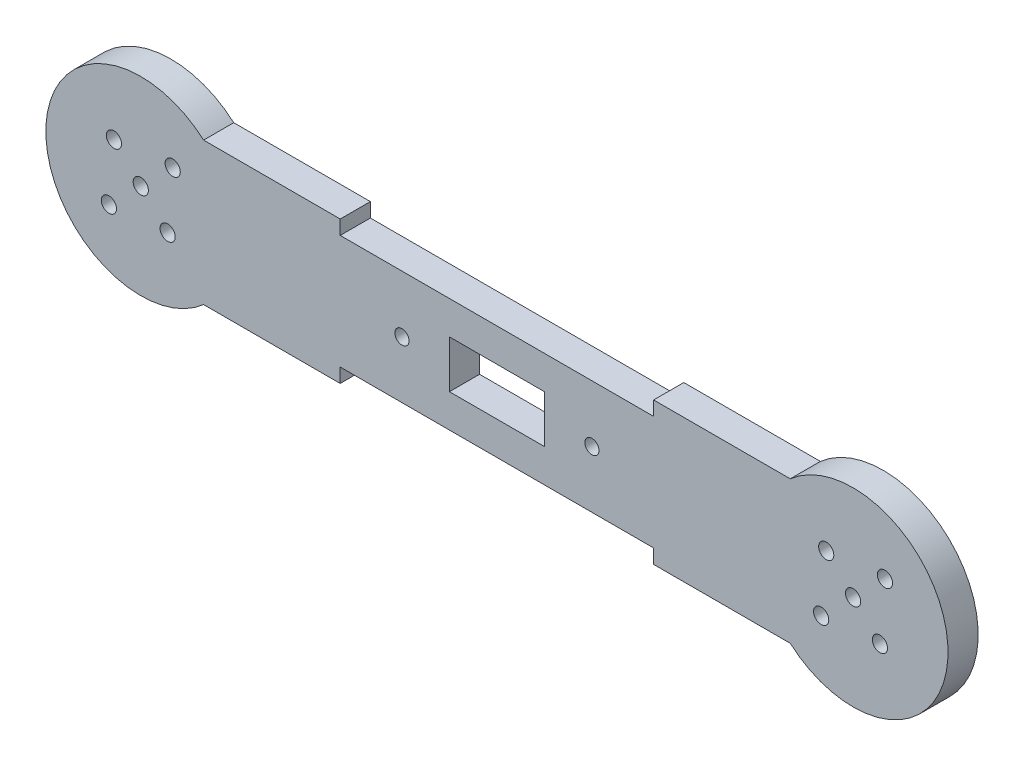
ISO-10303-21;
HEADER;
FILE_DESCRIPTION(('STEP AP214'),'2;1');
FILE_NAME('part.step','',(''),(''),'','','');
FILE_SCHEMA(('AUTOMOTIVE_DESIGN { 1 0 10303 214 1 1 1 1 }'));
ENDSEC;
DATA;
#1=APPLICATION_CONTEXT('core data for automotive mechanical design processes');
#2=APPLICATION_PROTOCOL_DEFINITION('international standard','automotive_design',2000,#1);
#3=PRODUCT_CONTEXT('',#1,'mechanical');
#4=PRODUCT('Part','Part','',(#3));
#5=PRODUCT_RELATED_PRODUCT_CATEGORY('part','',(#4));
#6=PRODUCT_DEFINITION_FORMATION('','',#4);
#7=PRODUCT_DEFINITION_CONTEXT('part definition',#1,'design');
#8=PRODUCT_DEFINITION('design','',#6,#7);
#9=PRODUCT_DEFINITION_SHAPE('','',#8);
#10=(LENGTH_UNIT() NAMED_UNIT(*) SI_UNIT(.MILLI.,.METRE.));
#11=(NAMED_UNIT(*) PLANE_ANGLE_UNIT() SI_UNIT($,.RADIAN.));
#12=(NAMED_UNIT(*) SI_UNIT($,.STERADIAN.) SOLID_ANGLE_UNIT());
#13=UNCERTAINTY_MEASURE_WITH_UNIT(LENGTH_MEASURE(1.E-05),#10,'distance_accuracy_value','');
#14=(GEOMETRIC_REPRESENTATION_CONTEXT(3) GLOBAL_UNCERTAINTY_ASSIGNED_CONTEXT((#13)) GLOBAL_UNIT_ASSIGNED_CONTEXT((#10,
#11,#12)) REPRESENTATION_CONTEXT('',''));
#15=CARTESIAN_POINT('',(0.,0.,0.));
#16=DIRECTION('',(0.,0.,1.));
#17=DIRECTION('',(1.,0.,0.));
#18=AXIS2_PLACEMENT_3D('',#15,#16,#17);
#19=CARTESIAN_POINT('',(-75.,0.,6.35));
#20=DIRECTION('',(0.,0.,1.));
#21=DIRECTION('',(1.,0.,0.));
#22=AXIS2_PLACEMENT_3D('',#19,#20,#21);
#23=PLANE('',#22);
#24=CARTESIAN_POINT('',(-75.,0.,6.35));
#25=DIRECTION('',(0.,0.,1.));
#26=DIRECTION('',(1.,0.,0.));
#27=AXIS2_PLACEMENT_3D('',#24,#25,#26);
#28=CIRCLE('',#27,1.59999999999999);
#29=CARTESIAN_POINT('',(-73.4,0.,6.35));
#30=VERTEX_POINT('',#29);
#31=EDGE_CURVE('E246',#30,#30,#28,.T.);
#32=ORIENTED_EDGE('',*,*,#31,.F.);
#33=EDGE_LOOP('',(#32));
#34=FACE_BOUND('',#33,.T.);
#35=CARTESIAN_POINT('',(75.,0.,6.35));
#36=DIRECTION('',(0.,0.,1.));
#37=DIRECTION('',(1.,0.,0.));
#38=AXIS2_PLACEMENT_3D('',#35,#36,#37);
#39=CIRCLE('',#38,1.59999999999999);
#40=CARTESIAN_POINT('',(76.6,0.,6.35));
#41=VERTEX_POINT('',#40);
#42=EDGE_CURVE('E325',#41,#41,#39,.T.);
#43=ORIENTED_EDGE('',*,*,#42,.F.);
#44=EDGE_LOOP('',(#43));
#45=FACE_BOUND('',#44,.T.);
#46=CARTESIAN_POINT('',(69.3431457505076,5.65685424949238,6.35));
#47=DIRECTION('',(0.,0.,1.));
#48=DIRECTION('',(1.,0.,0.));
#49=AXIS2_PLACEMENT_3D('',#46,#47,#48);
#50=CIRCLE('',#49,1.59999999999999);
#51=CARTESIAN_POINT('',(70.9431457505076,5.65685424949238,6.35));
#52=VERTEX_POINT('',#51);
#53=EDGE_CURVE('E312',#52,#52,#50,.T.);
#54=ORIENTED_EDGE('',*,*,#53,.F.);
#55=EDGE_LOOP('',(#54));
#56=FACE_BOUND('',#55,.T.);
#57=CARTESIAN_POINT('',(80.6568542494924,-5.65685424949241,6.35));
#58=DIRECTION('',(0.,0.,1.));
#59=DIRECTION('',(1.,0.,0.));
#60=AXIS2_PLACEMENT_3D('',#57,#58,#59);
#61=CIRCLE('',#60,1.59999999999999);
#62=CARTESIAN_POINT('',(82.2568542494924,-5.65685424949241,6.35));
#63=VERTEX_POINT('',#62);
#64=EDGE_CURVE('E321',#63,#63,#61,.T.);
#65=ORIENTED_EDGE('',*,*,#64,.F.);
#66=EDGE_LOOP('',(#65));
#67=FACE_BOUND('',#66,.T.);
#68=CARTESIAN_POINT('',(81.7175144212722,6.71751442127215,6.35));
#69=DIRECTION('',(0.,0.,1.));
#70=DIRECTION('',(1.,0.,0.));
#71=AXIS2_PLACEMENT_3D('',#68,#69,#70);
#72=CIRCLE('',#71,1.59999999999999);
#73=CARTESIAN_POINT('',(83.3175144212722,6.71751442127215,6.35));
#74=VERTEX_POINT('',#73);
#75=EDGE_CURVE('E347',#74,#74,#72,.T.);
#76=ORIENTED_EDGE('',*,*,#75,.F.);
#77=EDGE_LOOP('',(#76));
#78=FACE_BOUND('',#77,.T.);
#79=CARTESIAN_POINT('',(68.2824855787278,-6.71751442127219,6.35));
#80=DIRECTION('',(0.,0.,1.));
#81=DIRECTION('',(1.,0.,0.));
#82=AXIS2_PLACEMENT_3D('',#79,#80,#81);
#83=CIRCLE('',#82,1.59999999999999);
#84=CARTESIAN_POINT('',(69.8824855787278,-6.71751442127219,6.35));
#85=VERTEX_POINT('',#84);
#86=EDGE_CURVE('E354',#85,#85,#83,.T.);
#87=ORIENTED_EDGE('',*,*,#86,.F.);
#88=EDGE_LOOP('',(#87));
#89=FACE_BOUND('',#88,.T.);
#90=CARTESIAN_POINT('',(-68.2824855787278,6.71751442127221,6.35));
#91=DIRECTION('',(0.,0.,1.));
#92=DIRECTION('',(1.,0.,0.));
#93=AXIS2_PLACEMENT_3D('',#90,#91,#92);
#94=CIRCLE('',#93,1.59999999999999);
#95=CARTESIAN_POINT('',(-66.6824855787278,6.71751442127221,6.35));
#96=VERTEX_POINT('',#95);
#97=EDGE_CURVE('E362',#96,#96,#94,.T.);
#98=ORIENTED_EDGE('',*,*,#97,.F.);
#99=EDGE_LOOP('',(#98));
#100=FACE_BOUND('',#99,.T.);
#101=CARTESIAN_POINT('',(-80.6568542494924,5.65685424949235,6.35));
#102=DIRECTION('',(0.,0.,1.));
#103=DIRECTION('',(1.,0.,0.));
#104=AXIS2_PLACEMENT_3D('',#101,#102,#103);
#105=CIRCLE('',#104,1.59999999999999);
#106=CARTESIAN_POINT('',(-79.0568542494924,5.65685424949235,6.35));
#107=VERTEX_POINT('',#106);
#108=EDGE_CURVE('E373',#107,#107,#105,.T.);
#109=ORIENTED_EDGE('',*,*,#108,.F.);
#110=EDGE_LOOP('',(#109));
#111=FACE_BOUND('',#110,.T.);
#112=CARTESIAN_POINT('',(-69.3431457505076,-5.65685424949235,6.35));
#113=DIRECTION('',(0.,0.,1.));
#114=DIRECTION('',(1.,0.,0.));
#115=AXIS2_PLACEMENT_3D('',#112,#113,#114);
#116=CIRCLE('',#115,1.59999999999999);
#117=CARTESIAN_POINT('',(-67.7431457505076,-5.65685424949235,6.35));
#118=VERTEX_POINT('',#117);
#119=EDGE_CURVE('E380',#118,#118,#116,.T.);
#120=ORIENTED_EDGE('',*,*,#119,.F.);
#121=EDGE_LOOP('',(#120));
#122=FACE_BOUND('',#121,.T.);
#123=CARTESIAN_POINT('',(-81.7175144212722,-6.71751442127221,6.35));
#124=DIRECTION('',(0.,0.,1.));
#125=DIRECTION('',(1.,0.,0.));
#126=AXIS2_PLACEMENT_3D('',#123,#124,#125);
#127=CIRCLE('',#126,1.59999999999999);
#128=CARTESIAN_POINT('',(-80.1175144212722,-6.71751442127221,6.35));
#129=VERTEX_POINT('',#128);
#130=EDGE_CURVE('E388',#129,#129,#127,.T.);
#131=ORIENTED_EDGE('',*,*,#130,.F.);
#132=EDGE_LOOP('',(#131));
#133=FACE_BOUND('',#132,.T.);
#134=CARTESIAN_POINT('',(-20.,0.,6.35));
#135=DIRECTION('',(0.,0.,1.));
#136=DIRECTION('',(1.,0.,0.));
#137=AXIS2_PLACEMENT_3D('',#134,#135,#136);
#138=CIRCLE('',#137,1.5);
#139=CARTESIAN_POINT('',(-18.5,0.,6.35));
#140=VERTEX_POINT('',#139);
#141=EDGE_CURVE('E185',#140,#140,#138,.T.);
#142=ORIENTED_EDGE('',*,*,#141,.F.);
#143=EDGE_LOOP('',(#142));
#144=FACE_BOUND('',#143,.T.);
#145=CARTESIAN_POINT('',(20.,0.,6.35));
#146=DIRECTION('',(0.,0.,1.));
#147=DIRECTION('',(1.,0.,0.));
#148=AXIS2_PLACEMENT_3D('',#145,#146,#147);
#149=CIRCLE('',#148,1.5);
#150=CARTESIAN_POINT('',(21.5,0.,6.35));
#151=VERTEX_POINT('',#150);
#152=EDGE_CURVE('E401',#151,#151,#149,.T.);
#153=ORIENTED_EDGE('',*,*,#152,.F.);
#154=EDGE_LOOP('',(#153));
#155=FACE_BOUND('',#154,.T.);
#156=DIRECTION('',(-1.,0.,0.));
#157=VECTOR('',#156,1.);
#158=CARTESIAN_POINT('',(-10.,5.,6.35));
#159=LINE('',#158,#157);
#160=CARTESIAN_POINT('',(10.,5.,6.35));
#161=VERTEX_POINT('',#160);
#162=CARTESIAN_POINT('',(-10.,5.,6.35));
#163=VERTEX_POINT('',#162);
#164=EDGE_CURVE('E730',#161,#163,#159,.T.);
#165=ORIENTED_EDGE('',*,*,#164,.F.);
#166=DIRECTION('',(0.,1.,0.));
#167=VECTOR('',#166,1.);
#168=CARTESIAN_POINT('',(10.,5.,6.35));
#169=LINE('',#168,#167);
#170=CARTESIAN_POINT('',(10.,-5.,6.35));
#171=VERTEX_POINT('',#170);
#172=EDGE_CURVE('E732',#171,#161,#169,.T.);
#173=ORIENTED_EDGE('',*,*,#172,.F.);
#174=DIRECTION('',(1.,0.,0.));
#175=VECTOR('',#174,1.);
#176=CARTESIAN_POINT('',(-10.,-5.,6.35));
#177=LINE('',#176,#175);
#178=CARTESIAN_POINT('',(-9.99999999999999,-5.,6.35));
#179=VERTEX_POINT('',#178);
#180=EDGE_CURVE('E738',#179,#171,#177,.T.);
#181=ORIENTED_EDGE('',*,*,#180,.F.);
#182=DIRECTION('',(0.,-1.,0.));
#183=VECTOR('',#182,1.);
#184=CARTESIAN_POINT('',(-10.,5.,6.35));
#185=LINE('',#184,#183);
#186=EDGE_CURVE('E734',#163,#179,#185,.T.);
#187=ORIENTED_EDGE('',*,*,#186,.F.);
#188=EDGE_LOOP('',(#165,#173,#181,#187));
#189=FACE_BOUND('',#188,.T.);
#190=DIRECTION('',(1.,0.,0.));
#191=VECTOR('',#190,1.);
#192=CARTESIAN_POINT('',(-75.,-12.,6.35));
#193=LINE('',#192,#191);
#194=CARTESIAN_POINT('',(-33.,-12.,6.35));
#195=VERTEX_POINT('',#194);
#196=CARTESIAN_POINT('',(33.,-12.,6.35));
#197=VERTEX_POINT('',#196);
#198=EDGE_CURVE('E223',#195,#197,#193,.T.);
#199=ORIENTED_EDGE('',*,*,#198,.T.);
#200=DIRECTION('',(0.,-1.,0.));
#201=VECTOR('',#200,1.);
#202=CARTESIAN_POINT('',(33.,0.,6.35));
#203=LINE('',#202,#201);
#204=CARTESIAN_POINT('',(33.,-15.,6.35));
#205=VERTEX_POINT('',#204);
#206=EDGE_CURVE('E264',#197,#205,#203,.T.);
#207=ORIENTED_EDGE('',*,*,#206,.T.);
#208=DIRECTION('',(1.,0.,0.));
#209=VECTOR('',#208,1.);
#210=CARTESIAN_POINT('',(61.771243444677,-15.,6.35));
#211=LINE('',#210,#209);
#212=CARTESIAN_POINT('',(61.771243444677,-15.,6.35));
#213=VERTEX_POINT('',#212);
#214=EDGE_CURVE('E172',#205,#213,#211,.T.);
#215=ORIENTED_EDGE('',*,*,#214,.T.);
#216=CARTESIAN_POINT('',(75.,0.,6.35));
#217=DIRECTION('',(0.,0.,1.));
#218=DIRECTION('',(1.,0.,0.));
#219=AXIS2_PLACEMENT_3D('',#216,#217,#218);
#220=CIRCLE('',#219,20.);
#221=CARTESIAN_POINT('',(61.7712434446771,15.,6.35));
#222=VERTEX_POINT('',#221);
#223=EDGE_CURVE('E412',#213,#222,#220,.T.);
#224=ORIENTED_EDGE('',*,*,#223,.T.);
#225=DIRECTION('',(-1.,0.,0.));
#226=VECTOR('',#225,1.);
#227=CARTESIAN_POINT('',(61.7712434446771,15.,6.35));
#228=LINE('',#227,#226);
#229=CARTESIAN_POINT('',(33.,15.,6.35));
#230=VERTEX_POINT('',#229);
#231=EDGE_CURVE('E302',#222,#230,#228,.T.);
#232=ORIENTED_EDGE('',*,*,#231,.T.);
#233=DIRECTION('',(0.,1.,0.));
#234=VECTOR('',#233,1.);
#235=CARTESIAN_POINT('',(33.,0.,6.35));
#236=LINE('',#235,#234);
#237=CARTESIAN_POINT('',(33.,12.,6.35));
#238=VERTEX_POINT('',#237);
#239=EDGE_CURVE('E237',#238,#230,#236,.T.);
#240=ORIENTED_EDGE('',*,*,#239,.F.);
#241=DIRECTION('',(1.,0.,0.));
#242=VECTOR('',#241,1.);
#243=CARTESIAN_POINT('',(-75.,12.,6.35));
#244=LINE('',#243,#242);
#245=CARTESIAN_POINT('',(-33.,12.,6.35));
#246=VERTEX_POINT('',#245);
#247=EDGE_CURVE('E239',#246,#238,#244,.T.);
#248=ORIENTED_EDGE('',*,*,#247,.F.);
#249=DIRECTION('',(0.,-1.,0.));
#250=VECTOR('',#249,1.);
#251=CARTESIAN_POINT('',(-33.,0.,6.35));
#252=LINE('',#251,#250);
#253=CARTESIAN_POINT('',(-33.,15.,6.35));
#254=VERTEX_POINT('',#253);
#255=EDGE_CURVE('E234',#254,#246,#252,.T.);
#256=ORIENTED_EDGE('',*,*,#255,.F.);
#257=CARTESIAN_POINT('',(-61.771243444677,15.,6.35));
#258=VERTEX_POINT('',#257);
#259=EDGE_CURVE('E413',#254,#258,#228,.T.);
#260=ORIENTED_EDGE('',*,*,#259,.T.);
#261=CARTESIAN_POINT('',(-75.,0.,6.35));
#262=DIRECTION('',(0.,0.,1.));
#263=DIRECTION('',(1.,0.,0.));
#264=AXIS2_PLACEMENT_3D('',#261,#262,#263);
#265=CIRCLE('',#264,20.);
#266=CARTESIAN_POINT('',(-61.771243444677,-15.,6.35));
#267=VERTEX_POINT('',#266);
#268=EDGE_CURVE('E208',#258,#267,#265,.T.);
#269=ORIENTED_EDGE('',*,*,#268,.T.);
#270=CARTESIAN_POINT('',(-32.9999999999999,-15.,6.35));
#271=VERTEX_POINT('',#270);
#272=EDGE_CURVE('E278',#267,#271,#211,.T.);
#273=ORIENTED_EDGE('',*,*,#272,.T.);
#274=DIRECTION('',(0.,1.,0.));
#275=VECTOR('',#274,1.);
#276=CARTESIAN_POINT('',(-33.,0.,6.35));
#277=LINE('',#276,#275);
#278=EDGE_CURVE('E56',#271,#195,#277,.T.);
#279=ORIENTED_EDGE('',*,*,#278,.T.);
#280=EDGE_LOOP('',(#199,#207,#215,#224,#232,#240,#248,#256,#260,#269,#273,#279));
#281=FACE_BOUND('',#280,.T.);
#282=ADVANCED_FACE('F41',(#34,#45,#56,#67,#78,#89,#100,#111,#122,#133,#144,#155,#189,#281),#23,.T.);
#283=CARTESIAN_POINT('',(-75.,0.,0.));
#284=DIRECTION('',(0.,0.,1.));
#285=DIRECTION('',(1.,0.,0.));
#286=AXIS2_PLACEMENT_3D('',#283,#284,#285);
#287=PLANE('',#286);
#288=DIRECTION('',(0.,1.,0.));
#289=VECTOR('',#288,1.);
#290=CARTESIAN_POINT('',(10.,5.,0.));
#291=LINE('',#290,#289);
#292=CARTESIAN_POINT('',(9.99999999999999,-5.,0.));
#293=VERTEX_POINT('',#292);
#294=CARTESIAN_POINT('',(10.,5.,0.));
#295=VERTEX_POINT('',#294);
#296=EDGE_CURVE('E744',#293,#295,#291,.T.);
#297=ORIENTED_EDGE('',*,*,#296,.T.);
#298=DIRECTION('',(-1.,0.,0.));
#299=VECTOR('',#298,1.);
#300=CARTESIAN_POINT('',(-10.,5.,0.));
#301=LINE('',#300,#299);
#302=CARTESIAN_POINT('',(-10.,5.,0.));
#303=VERTEX_POINT('',#302);
#304=EDGE_CURVE('E749',#295,#303,#301,.T.);
#305=ORIENTED_EDGE('',*,*,#304,.T.);
#306=DIRECTION('',(0.,-1.,0.));
#307=VECTOR('',#306,1.);
#308=CARTESIAN_POINT('',(-10.,5.,0.));
#309=LINE('',#308,#307);
#310=CARTESIAN_POINT('',(-10.,-5.,0.));
#311=VERTEX_POINT('',#310);
#312=EDGE_CURVE('E756',#303,#311,#309,.T.);
#313=ORIENTED_EDGE('',*,*,#312,.T.);
#314=DIRECTION('',(1.,0.,0.));
#315=VECTOR('',#314,1.);
#316=CARTESIAN_POINT('',(-10.,-5.,0.));
#317=LINE('',#316,#315);
#318=EDGE_CURVE('E740',#311,#293,#317,.T.);
#319=ORIENTED_EDGE('',*,*,#318,.T.);
#320=EDGE_LOOP('',(#297,#305,#313,#319));
#321=FACE_BOUND('',#320,.T.);
#322=CARTESIAN_POINT('',(-20.,0.,0.));
#323=DIRECTION('',(0.,0.,1.));
#324=DIRECTION('',(1.,0.,0.));
#325=AXIS2_PLACEMENT_3D('',#322,#323,#324);
#326=CIRCLE('',#325,1.5);
#327=CARTESIAN_POINT('',(-18.5,0.,0.));
#328=VERTEX_POINT('',#327);
#329=EDGE_CURVE('E405',#328,#328,#326,.T.);
#330=ORIENTED_EDGE('',*,*,#329,.T.);
#331=EDGE_LOOP('',(#330));
#332=FACE_BOUND('',#331,.T.);
#333=CARTESIAN_POINT('',(20.,0.,0.));
#334=DIRECTION('',(0.,0.,1.));
#335=DIRECTION('',(1.,0.,0.));
#336=AXIS2_PLACEMENT_3D('',#333,#334,#335);
#337=CIRCLE('',#336,1.5);
#338=CARTESIAN_POINT('',(21.5,0.,0.));
#339=VERTEX_POINT('',#338);
#340=EDGE_CURVE('E395',#339,#339,#337,.T.);
#341=ORIENTED_EDGE('',*,*,#340,.T.);
#342=EDGE_LOOP('',(#341));
#343=FACE_BOUND('',#342,.T.);
#344=CARTESIAN_POINT('',(-81.7175144212722,-6.71751442127221,0.));
#345=DIRECTION('',(0.,0.,-1.));
#346=DIRECTION('',(-1.,0.,0.));
#347=AXIS2_PLACEMENT_3D('',#344,#345,#346);
#348=CIRCLE('',#347,1.59999999999999);
#349=CARTESIAN_POINT('',(-83.3175144212722,-6.71751442127221,0.));
#350=VERTEX_POINT('',#349);
#351=EDGE_CURVE('E383',#350,#350,#348,.T.);
#352=ORIENTED_EDGE('',*,*,#351,.F.);
#353=EDGE_LOOP('',(#352));
#354=FACE_BOUND('',#353,.T.);
#355=CARTESIAN_POINT('',(-69.3431457505076,-5.65685424949235,0.));
#356=DIRECTION('',(0.,0.,-1.));
#357=DIRECTION('',(-1.,0.,0.));
#358=AXIS2_PLACEMENT_3D('',#355,#356,#357);
#359=CIRCLE('',#358,1.59999999999999);
#360=CARTESIAN_POINT('',(-70.9431457505076,-5.65685424949235,0.));
#361=VERTEX_POINT('',#360);
#362=EDGE_CURVE('E375',#361,#361,#359,.T.);
#363=ORIENTED_EDGE('',*,*,#362,.F.);
#364=EDGE_LOOP('',(#363));
#365=FACE_BOUND('',#364,.T.);
#366=CARTESIAN_POINT('',(-80.6568542494924,5.65685424949235,0.));
#367=DIRECTION('',(0.,0.,-1.));
#368=DIRECTION('',(-1.,0.,0.));
#369=AXIS2_PLACEMENT_3D('',#366,#367,#368);
#370=CIRCLE('',#369,1.59999999999999);
#371=CARTESIAN_POINT('',(-82.2568542494924,5.65685424949235,0.));
#372=VERTEX_POINT('',#371);
#373=EDGE_CURVE('E368',#372,#372,#370,.T.);
#374=ORIENTED_EDGE('',*,*,#373,.F.);
#375=EDGE_LOOP('',(#374));
#376=FACE_BOUND('',#375,.T.);
#377=CARTESIAN_POINT('',(-68.2824855787278,6.71751442127221,0.));
#378=DIRECTION('',(0.,0.,-1.));
#379=DIRECTION('',(-1.,0.,0.));
#380=AXIS2_PLACEMENT_3D('',#377,#378,#379);
#381=CIRCLE('',#380,1.59999999999999);
#382=CARTESIAN_POINT('',(-69.8824855787278,6.71751442127221,0.));
#383=VERTEX_POINT('',#382);
#384=EDGE_CURVE('E357',#383,#383,#381,.T.);
#385=ORIENTED_EDGE('',*,*,#384,.F.);
#386=EDGE_LOOP('',(#385));
#387=FACE_BOUND('',#386,.T.);
#388=CARTESIAN_POINT('',(68.2824855787278,-6.71751442127219,0.));
#389=DIRECTION('',(0.,0.,-1.));
#390=DIRECTION('',(-1.,0.,0.));
#391=AXIS2_PLACEMENT_3D('',#388,#389,#390);
#392=CIRCLE('',#391,1.59999999999999);
#393=CARTESIAN_POINT('',(66.6824855787278,-6.71751442127219,0.));
#394=VERTEX_POINT('',#393);
#395=EDGE_CURVE('E349',#394,#394,#392,.T.);
#396=ORIENTED_EDGE('',*,*,#395,.F.);
#397=EDGE_LOOP('',(#396));
#398=FACE_BOUND('',#397,.T.);
#399=CARTESIAN_POINT('',(81.7175144212722,6.71751442127215,0.));
#400=DIRECTION('',(0.,0.,-1.));
#401=DIRECTION('',(-1.,0.,0.));
#402=AXIS2_PLACEMENT_3D('',#399,#400,#401);
#403=CIRCLE('',#402,1.59999999999999);
#404=CARTESIAN_POINT('',(80.1175144212722,6.71751442127215,0.));
#405=VERTEX_POINT('',#404);
#406=EDGE_CURVE('E342',#405,#405,#403,.T.);
#407=ORIENTED_EDGE('',*,*,#406,.F.);
#408=EDGE_LOOP('',(#407));
#409=FACE_BOUND('',#408,.T.);
#410=CARTESIAN_POINT('',(80.6568542494924,-5.65685424949241,0.));
#411=DIRECTION('',(0.,0.,-1.));
#412=DIRECTION('',(-1.,0.,0.));
#413=AXIS2_PLACEMENT_3D('',#410,#411,#412);
#414=CIRCLE('',#413,1.59999999999999);
#415=CARTESIAN_POINT('',(79.0568542494924,-5.65685424949241,0.));
#416=VERTEX_POINT('',#415);
#417=EDGE_CURVE('E314',#416,#416,#414,.T.);
#418=ORIENTED_EDGE('',*,*,#417,.F.);
#419=EDGE_LOOP('',(#418));
#420=FACE_BOUND('',#419,.T.);
#421=CARTESIAN_POINT('',(69.3431457505076,5.65685424949238,0.));
#422=DIRECTION('',(0.,0.,-1.));
#423=DIRECTION('',(-1.,0.,0.));
#424=AXIS2_PLACEMENT_3D('',#421,#422,#423);
#425=CIRCLE('',#424,1.59999999999999);
#426=CARTESIAN_POINT('',(67.7431457505077,5.65685424949238,0.));
#427=VERTEX_POINT('',#426);
#428=EDGE_CURVE('E315',#427,#427,#425,.T.);
#429=ORIENTED_EDGE('',*,*,#428,.F.);
#430=EDGE_LOOP('',(#429));
#431=FACE_BOUND('',#430,.T.);
#432=CARTESIAN_POINT('',(75.,0.,0.));
#433=DIRECTION('',(0.,0.,-1.));
#434=DIRECTION('',(-1.,0.,0.));
#435=AXIS2_PLACEMENT_3D('',#432,#433,#434);
#436=CIRCLE('',#435,1.59999999999999);
#437=CARTESIAN_POINT('',(73.4,0.,0.));
#438=VERTEX_POINT('',#437);
#439=EDGE_CURVE('E331',#438,#438,#436,.T.);
#440=ORIENTED_EDGE('',*,*,#439,.F.);
#441=EDGE_LOOP('',(#440));
#442=FACE_BOUND('',#441,.T.);
#443=CARTESIAN_POINT('',(-75.,0.,0.));
#444=DIRECTION('',(0.,0.,-1.));
#445=DIRECTION('',(-1.,0.,0.));
#446=AXIS2_PLACEMENT_3D('',#443,#444,#445);
#447=CIRCLE('',#446,1.59999999999999);
#448=CARTESIAN_POINT('',(-76.6,0.,0.));
#449=VERTEX_POINT('',#448);
#450=EDGE_CURVE('E241',#449,#449,#447,.T.);
#451=ORIENTED_EDGE('',*,*,#450,.F.);
#452=EDGE_LOOP('',(#451));
#453=FACE_BOUND('',#452,.T.);
#454=DIRECTION('',(0.,1.,0.));
#455=VECTOR('',#454,1.);
#456=CARTESIAN_POINT('',(33.,-15.,0.));
#457=LINE('',#456,#455);
#458=CARTESIAN_POINT('',(33.,-15.,0.));
#459=VERTEX_POINT('',#458);
#460=CARTESIAN_POINT('',(33.,-12.,0.));
#461=VERTEX_POINT('',#460);
#462=EDGE_CURVE('E153',#459,#461,#457,.T.);
#463=ORIENTED_EDGE('',*,*,#462,.T.);
#464=DIRECTION('',(-1.,0.,0.));
#465=VECTOR('',#464,1.);
#466=CARTESIAN_POINT('',(-33.,-12.,0.));
#467=LINE('',#466,#465);
#468=CARTESIAN_POINT('',(-33.,-12.,0.));
#469=VERTEX_POINT('',#468);
#470=EDGE_CURVE('E257',#461,#469,#467,.T.);
#471=ORIENTED_EDGE('',*,*,#470,.T.);
#472=DIRECTION('',(0.,-1.,0.));
#473=VECTOR('',#472,1.);
#474=CARTESIAN_POINT('',(-33.,-15.,0.));
#475=LINE('',#474,#473);
#476=CARTESIAN_POINT('',(-33.,-15.,0.));
#477=VERTEX_POINT('',#476);
#478=EDGE_CURVE('E164',#469,#477,#475,.T.);
#479=ORIENTED_EDGE('',*,*,#478,.T.);
#480=DIRECTION('',(1.,0.,0.));
#481=VECTOR('',#480,1.);
#482=CARTESIAN_POINT('',(61.771243444677,-15.,0.));
#483=LINE('',#482,#481);
#484=CARTESIAN_POINT('',(-61.771243444677,-15.,0.));
#485=VERTEX_POINT('',#484);
#486=EDGE_CURVE('E178',#485,#477,#483,.T.);
#487=ORIENTED_EDGE('',*,*,#486,.F.);
#488=CARTESIAN_POINT('',(-75.,0.,0.));
#489=DIRECTION('',(0.,0.,1.));
#490=DIRECTION('',(1.,0.,0.));
#491=AXIS2_PLACEMENT_3D('',#488,#489,#490);
#492=CIRCLE('',#491,20.);
#493=CARTESIAN_POINT('',(-61.771243444677,15.,0.));
#494=VERTEX_POINT('',#493);
#495=EDGE_CURVE('E179',#494,#485,#492,.T.);
#496=ORIENTED_EDGE('',*,*,#495,.F.);
#497=DIRECTION('',(-1.,0.,0.));
#498=VECTOR('',#497,1.);
#499=CARTESIAN_POINT('',(61.7712434446771,15.,0.));
#500=LINE('',#499,#498);
#501=CARTESIAN_POINT('',(-32.9999999999999,15.,0.));
#502=VERTEX_POINT('',#501);
#503=EDGE_CURVE('E209',#502,#494,#500,.T.);
#504=ORIENTED_EDGE('',*,*,#503,.F.);
#505=DIRECTION('',(0.,1.,0.));
#506=VECTOR('',#505,1.);
#507=CARTESIAN_POINT('',(-33.,15.,0.));
#508=LINE('',#507,#506);
#509=CARTESIAN_POINT('',(-33.,12.,0.));
#510=VERTEX_POINT('',#509);
#511=EDGE_CURVE('E64',#510,#502,#508,.T.);
#512=ORIENTED_EDGE('',*,*,#511,.F.);
#513=DIRECTION('',(-1.,0.,0.));
#514=VECTOR('',#513,1.);
#515=CARTESIAN_POINT('',(-33.,12.,0.));
#516=LINE('',#515,#514);
#517=CARTESIAN_POINT('',(33.,12.,0.));
#518=VERTEX_POINT('',#517);
#519=EDGE_CURVE('E222',#518,#510,#516,.T.);
#520=ORIENTED_EDGE('',*,*,#519,.F.);
#521=DIRECTION('',(0.,-1.,0.));
#522=VECTOR('',#521,1.);
#523=CARTESIAN_POINT('',(33.,15.,0.));
#524=LINE('',#523,#522);
#525=CARTESIAN_POINT('',(33.,15.,0.));
#526=VERTEX_POINT('',#525);
#527=EDGE_CURVE('E217',#526,#518,#524,.T.);
#528=ORIENTED_EDGE('',*,*,#527,.F.);
#529=CARTESIAN_POINT('',(61.7712434446771,15.,0.));
#530=VERTEX_POINT('',#529);
#531=EDGE_CURVE('E203',#530,#526,#500,.T.);
#532=ORIENTED_EDGE('',*,*,#531,.F.);
#533=CARTESIAN_POINT('',(75.,0.,0.));
#534=DIRECTION('',(0.,0.,1.));
#535=DIRECTION('',(1.,0.,0.));
#536=AXIS2_PLACEMENT_3D('',#533,#534,#535);
#537=CIRCLE('',#536,20.);
#538=CARTESIAN_POINT('',(61.771243444677,-15.,0.));
#539=VERTEX_POINT('',#538);
#540=EDGE_CURVE('E176',#539,#530,#537,.T.);
#541=ORIENTED_EDGE('',*,*,#540,.F.);
#542=EDGE_CURVE('E170',#459,#539,#483,.T.);
#543=ORIENTED_EDGE('',*,*,#542,.F.);
#544=EDGE_LOOP('',(#463,#471,#479,#487,#496,#504,#512,#520,#528,#532,#541,#543));
#545=FACE_BOUND('',#544,.T.);
#546=ADVANCED_FACE('F174',(#321,#332,#343,#354,#365,#376,#387,#398,#409,#420,#431,#442,#453,
#545),#287,.F.);
#547=CARTESIAN_POINT('',(61.771243444677,-15.,6.35));
#548=DIRECTION('',(0.,1.,0.));
#549=DIRECTION('',(-1.,0.,0.));
#550=AXIS2_PLACEMENT_3D('',#547,#548,#549);
#551=PLANE('',#550);
#552=DIRECTION('',(0.,0.,1.));
#553=VECTOR('',#552,1.);
#554=CARTESIAN_POINT('',(33.,-15.,6.35));
#555=LINE('',#554,#553);
#556=EDGE_CURVE('E12',#459,#205,#555,.T.);
#557=ORIENTED_EDGE('',*,*,#556,.F.);
#558=ORIENTED_EDGE('',*,*,#542,.T.);
#559=DIRECTION('',(0.,0.,-1.));
#560=VECTOR('',#559,1.);
#561=CARTESIAN_POINT('',(61.771243444677,-15.,6.35));
#562=LINE('',#561,#560);
#563=EDGE_CURVE('E283',#213,#539,#562,.T.);
#564=ORIENTED_EDGE('',*,*,#563,.F.);
#565=ORIENTED_EDGE('',*,*,#214,.F.);
#566=EDGE_LOOP('',(#557,#558,#564,#565));
#567=FACE_BOUND('',#566,.T.);
#568=ADVANCED_FACE('F168',(#567),#551,.F.);
#569=DIRECTION('',(0.,0.,-1.));
#570=VECTOR('',#569,1.);
#571=CARTESIAN_POINT('',(-33.,-15.,6.35));
#572=LINE('',#571,#570);
#573=EDGE_CURVE('E49',#271,#477,#572,.T.);
#574=ORIENTED_EDGE('',*,*,#573,.F.);
#575=ORIENTED_EDGE('',*,*,#272,.F.);
#576=DIRECTION('',(0.,0.,-1.));
#577=VECTOR('',#576,1.);
#578=CARTESIAN_POINT('',(-61.771243444677,-15.,6.35));
#579=LINE('',#578,#577);
#580=EDGE_CURVE('E277',#267,#485,#579,.T.);
#581=ORIENTED_EDGE('',*,*,#580,.T.);
#582=ORIENTED_EDGE('',*,*,#486,.T.);
#583=EDGE_LOOP('',(#574,#575,#581,#582));
#584=FACE_BOUND('',#583,.T.);
#585=ADVANCED_FACE('F275',(#584),#551,.F.);
#586=CARTESIAN_POINT('',(61.7712434446771,15.,6.35));
#587=DIRECTION('',(0.,-1.,0.));
#588=DIRECTION('',(1.,0.,0.));
#589=AXIS2_PLACEMENT_3D('',#586,#587,#588);
#590=PLANE('',#589);
#591=ORIENTED_EDGE('',*,*,#531,.T.);
#592=DIRECTION('',(0.,0.,1.));
#593=VECTOR('',#592,1.);
#594=CARTESIAN_POINT('',(33.,15.,6.35));
#595=LINE('',#594,#593);
#596=EDGE_CURVE('E308',#526,#230,#595,.T.);
#597=ORIENTED_EDGE('',*,*,#596,.T.);
#598=ORIENTED_EDGE('',*,*,#231,.F.);
#599=DIRECTION('',(0.,0.,-1.));
#600=VECTOR('',#599,1.);
#601=CARTESIAN_POINT('',(61.7712434446771,15.,6.35));
#602=LINE('',#601,#600);
#603=EDGE_CURVE('E296',#222,#530,#602,.T.);
#604=ORIENTED_EDGE('',*,*,#603,.T.);
#605=EDGE_LOOP('',(#591,#597,#598,#604));
#606=FACE_BOUND('',#605,.T.);
#607=ADVANCED_FACE('F299',(#606),#590,.F.);
#608=CARTESIAN_POINT('',(-75.,0.,6.35));
#609=DIRECTION('',(0.,0.,-1.));
#610=DIRECTION('',(-1.,0.,0.));
#611=AXIS2_PLACEMENT_3D('',#608,#609,#610);
#612=CYLINDRICAL_SURFACE('',#611,20.);
#613=ORIENTED_EDGE('',*,*,#495,.T.);
#614=ORIENTED_EDGE('',*,*,#580,.F.);
#615=ORIENTED_EDGE('',*,*,#268,.F.);
#616=DIRECTION('',(0.,0.,-1.));
#617=VECTOR('',#616,1.);
#618=CARTESIAN_POINT('',(-61.771243444677,15.,6.35));
#619=LINE('',#618,#617);
#620=EDGE_CURVE('E210',#258,#494,#619,.T.);
#621=ORIENTED_EDGE('',*,*,#620,.T.);
#622=EDGE_LOOP('',(#613,#614,#615,#621));
#623=FACE_BOUND('',#622,.T.);
#624=ADVANCED_FACE('F43',(#623),#612,.T.);
#625=CARTESIAN_POINT('',(75.,0.,6.35));
#626=DIRECTION('',(0.,0.,-1.));
#627=DIRECTION('',(-1.,0.,0.));
#628=AXIS2_PLACEMENT_3D('',#625,#626,#627);
#629=CYLINDRICAL_SURFACE('',#628,20.);
#630=ORIENTED_EDGE('',*,*,#540,.T.);
#631=ORIENTED_EDGE('',*,*,#603,.F.);
#632=ORIENTED_EDGE('',*,*,#223,.F.);
#633=ORIENTED_EDGE('',*,*,#563,.T.);
#634=EDGE_LOOP('',(#630,#631,#632,#633));
#635=FACE_BOUND('',#634,.T.);
#636=ADVANCED_FACE('F294',(#635),#629,.T.);
#637=ORIENTED_EDGE('',*,*,#259,.F.);
#638=DIRECTION('',(0.,0.,-1.));
#639=VECTOR('',#638,1.);
#640=CARTESIAN_POINT('',(-33.,15.,6.35));
#641=LINE('',#640,#639);
#642=EDGE_CURVE('E282',#254,#502,#641,.T.);
#643=ORIENTED_EDGE('',*,*,#642,.T.);
#644=ORIENTED_EDGE('',*,*,#503,.T.);
#645=ORIENTED_EDGE('',*,*,#620,.F.);
#646=EDGE_LOOP('',(#637,#643,#644,#645));
#647=FACE_BOUND('',#646,.T.);
#648=ADVANCED_FACE('F417',(#647),#590,.F.);
#649=CARTESIAN_POINT('',(-20.,0.,6.35));
#650=DIRECTION('',(0.,0.,-1.));
#651=DIRECTION('',(-1.,0.,0.));
#652=AXIS2_PLACEMENT_3D('',#649,#650,#651);
#653=CYLINDRICAL_SURFACE('',#652,1.5);
#654=ORIENTED_EDGE('',*,*,#141,.T.);
#655=EDGE_LOOP('',(#654));
#656=FACE_BOUND('',#655,.T.);
#657=ORIENTED_EDGE('',*,*,#329,.F.);
#658=EDGE_LOOP('',(#657));
#659=FACE_BOUND('',#658,.T.);
#660=ADVANCED_FACE('F419',(#656,#659),#653,.F.);
#661=CARTESIAN_POINT('',(20.,0.,6.35));
#662=DIRECTION('',(0.,0.,-1.));
#663=DIRECTION('',(-1.,0.,0.));
#664=AXIS2_PLACEMENT_3D('',#661,#662,#663);
#665=CYLINDRICAL_SURFACE('',#664,1.5);
#666=ORIENTED_EDGE('',*,*,#152,.T.);
#667=EDGE_LOOP('',(#666));
#668=FACE_BOUND('',#667,.T.);
#669=ORIENTED_EDGE('',*,*,#340,.F.);
#670=EDGE_LOOP('',(#669));
#671=FACE_BOUND('',#670,.T.);
#672=ADVANCED_FACE('F425',(#668,#671),#665,.F.);
#673=CARTESIAN_POINT('',(10.,5.,6.35));
#674=DIRECTION('',(-1.,0.,0.));
#675=DIRECTION('',(0.,0.,1.));
#676=AXIS2_PLACEMENT_3D('',#673,#674,#675);
#677=PLANE('',#676);
#678=ORIENTED_EDGE('',*,*,#296,.F.);
#679=DIRECTION('',(0.,0.,-1.));
#680=VECTOR('',#679,1.);
#681=CARTESIAN_POINT('',(10.,-5.,6.35));
#682=LINE('',#681,#680);
#683=EDGE_CURVE('E743',#171,#293,#682,.T.);
#684=ORIENTED_EDGE('',*,*,#683,.F.);
#685=ORIENTED_EDGE('',*,*,#172,.T.);
#686=DIRECTION('',(0.,0.,-1.));
#687=VECTOR('',#686,1.);
#688=CARTESIAN_POINT('',(10.,5.,6.35));
#689=LINE('',#688,#687);
#690=EDGE_CURVE('E402',#161,#295,#689,.T.);
#691=ORIENTED_EDGE('',*,*,#690,.T.);
#692=EDGE_LOOP('',(#678,#684,#685,#691));
#693=FACE_BOUND('',#692,.T.);
#694=ADVANCED_FACE('F443',(#693),#677,.T.);
#695=CARTESIAN_POINT('',(-10.,5.,6.35));
#696=DIRECTION('',(0.,-1.,0.));
#697=DIRECTION('',(0.,0.,-1.));
#698=AXIS2_PLACEMENT_3D('',#695,#696,#697);
#699=PLANE('',#698);
#700=ORIENTED_EDGE('',*,*,#304,.F.);
#701=ORIENTED_EDGE('',*,*,#690,.F.);
#702=ORIENTED_EDGE('',*,*,#164,.T.);
#703=DIRECTION('',(0.,0.,-1.));
#704=VECTOR('',#703,1.);
#705=CARTESIAN_POINT('',(-10.,5.,6.35));
#706=LINE('',#705,#704);
#707=EDGE_CURVE('E768',#163,#303,#706,.T.);
#708=ORIENTED_EDGE('',*,*,#707,.T.);
#709=EDGE_LOOP('',(#700,#701,#702,#708));
#710=FACE_BOUND('',#709,.T.);
#711=ADVANCED_FACE('F447',(#710),#699,.T.);
#712=CARTESIAN_POINT('',(-10.,5.,6.35));
#713=DIRECTION('',(1.,0.,0.));
#714=DIRECTION('',(0.,1.,0.));
#715=AXIS2_PLACEMENT_3D('',#712,#713,#714);
#716=PLANE('',#715);
#717=ORIENTED_EDGE('',*,*,#312,.F.);
#718=ORIENTED_EDGE('',*,*,#707,.F.);
#719=ORIENTED_EDGE('',*,*,#186,.T.);
#720=DIRECTION('',(0.,0.,-1.));
#721=VECTOR('',#720,1.);
#722=CARTESIAN_POINT('',(-10.,-5.,6.35));
#723=LINE('',#722,#721);
#724=EDGE_CURVE('E766',#179,#311,#723,.T.);
#725=ORIENTED_EDGE('',*,*,#724,.T.);
#726=EDGE_LOOP('',(#717,#718,#719,#725));
#727=FACE_BOUND('',#726,.T.);
#728=ADVANCED_FACE('F451',(#727),#716,.T.);
#729=CARTESIAN_POINT('',(-10.,-5.,6.35));
#730=DIRECTION('',(0.,1.,0.));
#731=DIRECTION('',(0.,0.,1.));
#732=AXIS2_PLACEMENT_3D('',#729,#730,#731);
#733=PLANE('',#732);
#734=ORIENTED_EDGE('',*,*,#318,.F.);
#735=ORIENTED_EDGE('',*,*,#724,.F.);
#736=ORIENTED_EDGE('',*,*,#180,.T.);
#737=ORIENTED_EDGE('',*,*,#683,.T.);
#738=EDGE_LOOP('',(#734,#735,#736,#737));
#739=FACE_BOUND('',#738,.T.);
#740=ADVANCED_FACE('F455',(#739),#733,.T.);
#741=CARTESIAN_POINT('',(-81.7175144212722,-6.71751442127221,0.));
#742=DIRECTION('',(0.,0.,-1.));
#743=DIRECTION('',(-1.,0.,0.));
#744=AXIS2_PLACEMENT_3D('',#741,#742,#743);
#745=CYLINDRICAL_SURFACE('',#744,1.59999999999999);
#746=ORIENTED_EDGE('',*,*,#130,.T.);
#747=EDGE_LOOP('',(#746));
#748=FACE_BOUND('',#747,.T.);
#749=ORIENTED_EDGE('',*,*,#351,.T.);
#750=EDGE_LOOP('',(#749));
#751=FACE_BOUND('',#750,.T.);
#752=ADVANCED_FACE('F459',(#748,#751),#745,.F.);
#753=CARTESIAN_POINT('',(-69.3431457505076,-5.65685424949235,0.));
#754=DIRECTION('',(0.,0.,-1.));
#755=DIRECTION('',(-1.,0.,0.));
#756=AXIS2_PLACEMENT_3D('',#753,#754,#755);
#757=CYLINDRICAL_SURFACE('',#756,1.59999999999999);
#758=ORIENTED_EDGE('',*,*,#119,.T.);
#759=EDGE_LOOP('',(#758));
#760=FACE_BOUND('',#759,.T.);
#761=ORIENTED_EDGE('',*,*,#362,.T.);
#762=EDGE_LOOP('',(#761));
#763=FACE_BOUND('',#762,.T.);
#764=ADVANCED_FACE('F463',(#760,#763),#757,.F.);
#765=CARTESIAN_POINT('',(-80.6568542494924,5.65685424949235,0.));
#766=DIRECTION('',(0.,0.,-1.));
#767=DIRECTION('',(-1.,0.,0.));
#768=AXIS2_PLACEMENT_3D('',#765,#766,#767);
#769=CYLINDRICAL_SURFACE('',#768,1.59999999999999);
#770=ORIENTED_EDGE('',*,*,#108,.T.);
#771=EDGE_LOOP('',(#770));
#772=FACE_BOUND('',#771,.T.);
#773=ORIENTED_EDGE('',*,*,#373,.T.);
#774=EDGE_LOOP('',(#773));
#775=FACE_BOUND('',#774,.T.);
#776=ADVANCED_FACE('F467',(#772,#775),#769,.F.);
#777=CARTESIAN_POINT('',(-68.2824855787278,6.71751442127221,0.));
#778=DIRECTION('',(0.,0.,-1.));
#779=DIRECTION('',(-1.,0.,0.));
#780=AXIS2_PLACEMENT_3D('',#777,#778,#779);
#781=CYLINDRICAL_SURFACE('',#780,1.59999999999999);
#782=ORIENTED_EDGE('',*,*,#97,.T.);
#783=EDGE_LOOP('',(#782));
#784=FACE_BOUND('',#783,.T.);
#785=ORIENTED_EDGE('',*,*,#384,.T.);
#786=EDGE_LOOP('',(#785));
#787=FACE_BOUND('',#786,.T.);
#788=ADVANCED_FACE('F471',(#784,#787),#781,.F.);
#789=CARTESIAN_POINT('',(68.2824855787278,-6.71751442127219,0.));
#790=DIRECTION('',(0.,0.,-1.));
#791=DIRECTION('',(-1.,0.,0.));
#792=AXIS2_PLACEMENT_3D('',#789,#790,#791);
#793=CYLINDRICAL_SURFACE('',#792,1.59999999999999);
#794=ORIENTED_EDGE('',*,*,#86,.T.);
#795=EDGE_LOOP('',(#794));
#796=FACE_BOUND('',#795,.T.);
#797=ORIENTED_EDGE('',*,*,#395,.T.);
#798=EDGE_LOOP('',(#797));
#799=FACE_BOUND('',#798,.T.);
#800=ADVANCED_FACE('F475',(#796,#799),#793,.F.);
#801=CARTESIAN_POINT('',(81.7175144212722,6.71751442127215,0.));
#802=DIRECTION('',(0.,0.,-1.));
#803=DIRECTION('',(-1.,0.,0.));
#804=AXIS2_PLACEMENT_3D('',#801,#802,#803);
#805=CYLINDRICAL_SURFACE('',#804,1.59999999999999);
#806=ORIENTED_EDGE('',*,*,#75,.T.);
#807=EDGE_LOOP('',(#806));
#808=FACE_BOUND('',#807,.T.);
#809=ORIENTED_EDGE('',*,*,#406,.T.);
#810=EDGE_LOOP('',(#809));
#811=FACE_BOUND('',#810,.T.);
#812=ADVANCED_FACE('F479',(#808,#811),#805,.F.);
#813=CARTESIAN_POINT('',(80.6568542494924,-5.65685424949241,0.));
#814=DIRECTION('',(0.,0.,-1.));
#815=DIRECTION('',(-1.,0.,0.));
#816=AXIS2_PLACEMENT_3D('',#813,#814,#815);
#817=CYLINDRICAL_SURFACE('',#816,1.59999999999999);
#818=ORIENTED_EDGE('',*,*,#64,.T.);
#819=EDGE_LOOP('',(#818));
#820=FACE_BOUND('',#819,.T.);
#821=ORIENTED_EDGE('',*,*,#417,.T.);
#822=EDGE_LOOP('',(#821));
#823=FACE_BOUND('',#822,.T.);
#824=ADVANCED_FACE('F483',(#820,#823),#817,.F.);
#825=CARTESIAN_POINT('',(69.3431457505076,5.65685424949238,0.));
#826=DIRECTION('',(0.,0.,-1.));
#827=DIRECTION('',(-1.,0.,0.));
#828=AXIS2_PLACEMENT_3D('',#825,#826,#827);
#829=CYLINDRICAL_SURFACE('',#828,1.59999999999999);
#830=ORIENTED_EDGE('',*,*,#53,.T.);
#831=EDGE_LOOP('',(#830));
#832=FACE_BOUND('',#831,.T.);
#833=ORIENTED_EDGE('',*,*,#428,.T.);
#834=EDGE_LOOP('',(#833));
#835=FACE_BOUND('',#834,.T.);
#836=ADVANCED_FACE('F487',(#832,#835),#829,.F.);
#837=CARTESIAN_POINT('',(75.,0.,0.));
#838=DIRECTION('',(0.,0.,-1.));
#839=DIRECTION('',(-1.,0.,0.));
#840=AXIS2_PLACEMENT_3D('',#837,#838,#839);
#841=CYLINDRICAL_SURFACE('',#840,1.59999999999999);
#842=ORIENTED_EDGE('',*,*,#42,.T.);
#843=EDGE_LOOP('',(#842));
#844=FACE_BOUND('',#843,.T.);
#845=ORIENTED_EDGE('',*,*,#439,.T.);
#846=EDGE_LOOP('',(#845));
#847=FACE_BOUND('',#846,.T.);
#848=ADVANCED_FACE('F491',(#844,#847),#841,.F.);
#849=CARTESIAN_POINT('',(-75.,0.,0.));
#850=DIRECTION('',(0.,0.,-1.));
#851=DIRECTION('',(-1.,0.,0.));
#852=AXIS2_PLACEMENT_3D('',#849,#850,#851);
#853=CYLINDRICAL_SURFACE('',#852,1.59999999999999);
#854=ORIENTED_EDGE('',*,*,#31,.T.);
#855=EDGE_LOOP('',(#854));
#856=FACE_BOUND('',#855,.T.);
#857=ORIENTED_EDGE('',*,*,#450,.T.);
#858=EDGE_LOOP('',(#857));
#859=FACE_BOUND('',#858,.T.);
#860=ADVANCED_FACE('F494',(#856,#859),#853,.F.);
#861=CARTESIAN_POINT('',(33.,15.,10.));
#862=DIRECTION('',(1.,0.,0.));
#863=DIRECTION('',(0.,0.,-1.));
#864=AXIS2_PLACEMENT_3D('',#861,#862,#863);
#865=PLANE('',#864);
#866=ORIENTED_EDGE('',*,*,#239,.T.);
#867=ORIENTED_EDGE('',*,*,#596,.F.);
#868=ORIENTED_EDGE('',*,*,#527,.T.);
#869=DIRECTION('',(0.,0.,-1.));
#870=VECTOR('',#869,1.);
#871=CARTESIAN_POINT('',(33.,12.,10.));
#872=LINE('',#871,#870);
#873=EDGE_CURVE('E231',#238,#518,#872,.T.);
#874=ORIENTED_EDGE('',*,*,#873,.F.);
#875=EDGE_LOOP('',(#866,#867,#868,#874));
#876=FACE_BOUND('',#875,.T.);
#877=ADVANCED_FACE('F306',(#876),#865,.F.);
#878=CARTESIAN_POINT('',(-33.,15.,10.));
#879=DIRECTION('',(-1.,0.,0.));
#880=DIRECTION('',(0.,0.,1.));
#881=AXIS2_PLACEMENT_3D('',#878,#879,#880);
#882=PLANE('',#881);
#883=ORIENTED_EDGE('',*,*,#255,.T.);
#884=DIRECTION('',(0.,0.,-1.));
#885=VECTOR('',#884,1.);
#886=CARTESIAN_POINT('',(-33.,12.,10.));
#887=LINE('',#886,#885);
#888=EDGE_CURVE('E232',#246,#510,#887,.T.);
#889=ORIENTED_EDGE('',*,*,#888,.T.);
#890=ORIENTED_EDGE('',*,*,#511,.T.);
#891=ORIENTED_EDGE('',*,*,#642,.F.);
#892=EDGE_LOOP('',(#883,#889,#890,#891));
#893=FACE_BOUND('',#892,.T.);
#894=ADVANCED_FACE('F501',(#893),#882,.F.);
#895=CARTESIAN_POINT('',(-33.,12.,10.));
#896=DIRECTION('',(0.,-1.,0.));
#897=DIRECTION('',(1.,0.,0.));
#898=AXIS2_PLACEMENT_3D('',#895,#896,#897);
#899=PLANE('',#898);
#900=ORIENTED_EDGE('',*,*,#247,.T.);
#901=ORIENTED_EDGE('',*,*,#873,.T.);
#902=ORIENTED_EDGE('',*,*,#519,.T.);
#903=ORIENTED_EDGE('',*,*,#888,.F.);
#904=EDGE_LOOP('',(#900,#901,#902,#903));
#905=FACE_BOUND('',#904,.T.);
#906=ADVANCED_FACE('F502',(#905),#899,.F.);
#907=CARTESIAN_POINT('',(33.,-15.,10.));
#908=DIRECTION('',(-1.,0.,0.));
#909=DIRECTION('',(0.,0.,1.));
#910=AXIS2_PLACEMENT_3D('',#907,#908,#909);
#911=PLANE('',#910);
#912=DIRECTION('',(0.,0.,-1.));
#913=VECTOR('',#912,1.);
#914=CARTESIAN_POINT('',(33.,-12.,10.));
#915=LINE('',#914,#913);
#916=EDGE_CURVE('E158',#197,#461,#915,.T.);
#917=ORIENTED_EDGE('',*,*,#916,.T.);
#918=ORIENTED_EDGE('',*,*,#462,.F.);
#919=ORIENTED_EDGE('',*,*,#556,.T.);
#920=ORIENTED_EDGE('',*,*,#206,.F.);
#921=EDGE_LOOP('',(#917,#918,#919,#920));
#922=FACE_BOUND('',#921,.T.);
#923=ADVANCED_FACE('F155',(#922),#911,.T.);
#924=CARTESIAN_POINT('',(-33.,-12.,10.));
#925=DIRECTION('',(0.,-1.,0.));
#926=DIRECTION('',(1.,0.,0.));
#927=AXIS2_PLACEMENT_3D('',#924,#925,#926);
#928=PLANE('',#927);
#929=DIRECTION('',(0.,0.,-1.));
#930=VECTOR('',#929,1.);
#931=CARTESIAN_POINT('',(-33.,-12.,10.));
#932=LINE('',#931,#930);
#933=EDGE_CURVE('E261',#195,#469,#932,.T.);
#934=ORIENTED_EDGE('',*,*,#933,.T.);
#935=ORIENTED_EDGE('',*,*,#470,.F.);
#936=ORIENTED_EDGE('',*,*,#916,.F.);
#937=ORIENTED_EDGE('',*,*,#198,.F.);
#938=EDGE_LOOP('',(#934,#935,#936,#937));
#939=FACE_BOUND('',#938,.T.);
#940=ADVANCED_FACE('F269',(#939),#928,.T.);
#941=CARTESIAN_POINT('',(-33.,-15.,10.));
#942=DIRECTION('',(1.,0.,0.));
#943=DIRECTION('',(0.,0.,-1.));
#944=AXIS2_PLACEMENT_3D('',#941,#942,#943);
#945=PLANE('',#944);
#946=ORIENTED_EDGE('',*,*,#573,.T.);
#947=ORIENTED_EDGE('',*,*,#478,.F.);
#948=ORIENTED_EDGE('',*,*,#933,.F.);
#949=ORIENTED_EDGE('',*,*,#278,.F.);
#950=EDGE_LOOP('',(#946,#947,#948,#949));
#951=FACE_BOUND('',#950,.T.);
#952=ADVANCED_FACE('F271',(#951),#945,.T.);
#953=CLOSED_SHELL('',(#282,#546,#568,#585,#607,#624,#636,#648,#660,#672,#694,#711,#728,#740,
#752,#764,#776,#788,#800,#812,#824,#836,#848,#860,#877,#894,#906,#923,#940,#952));
#954=MANIFOLD_SOLID_BREP('B2',#953);
#955=ADVANCED_BREP_SHAPE_REPRESENTATION('',(#18,#954),#14);
#956=SHAPE_DEFINITION_REPRESENTATION(#9,#955);
ENDSEC;
END-ISO-10303-21;
